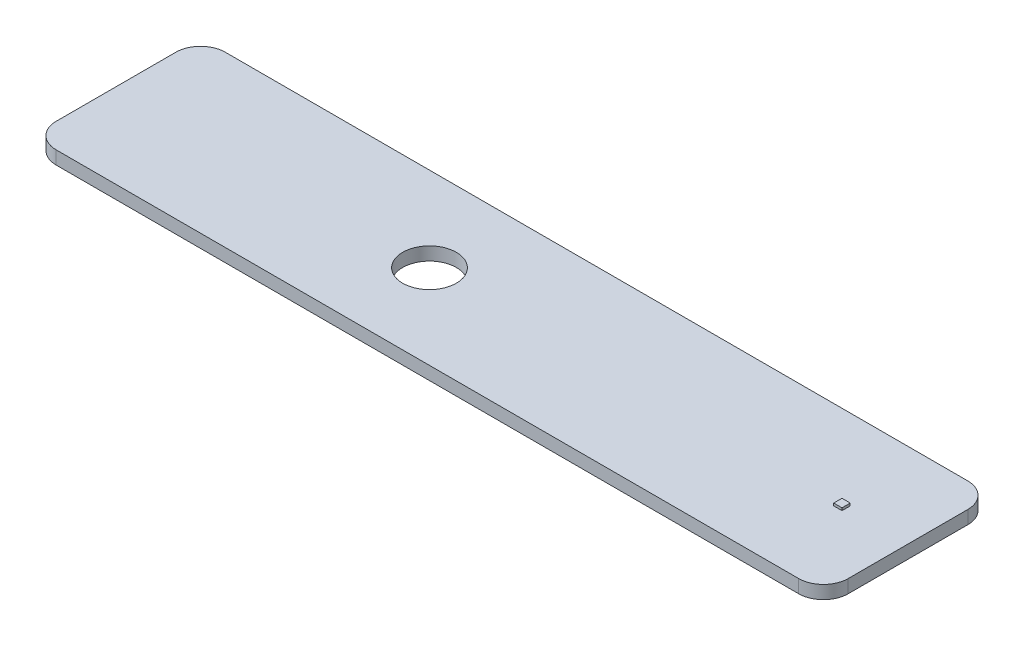
ISO-10303-21;
HEADER;
FILE_DESCRIPTION(('STEP AP214'),'2;1');
FILE_NAME('part.step','',(''),(''),'','','');
FILE_SCHEMA(('AUTOMOTIVE_DESIGN { 1 0 10303 214 1 1 1 1 }'));
ENDSEC;
DATA;
#1=APPLICATION_CONTEXT('core data for automotive mechanical design processes');
#2=APPLICATION_PROTOCOL_DEFINITION('international standard','automotive_design',2000,#1);
#3=PRODUCT_CONTEXT('',#1,'mechanical');
#4=PRODUCT('Part','Part','',(#3));
#5=PRODUCT_RELATED_PRODUCT_CATEGORY('part','',(#4));
#6=PRODUCT_DEFINITION_FORMATION('','',#4);
#7=PRODUCT_DEFINITION_CONTEXT('part definition',#1,'design');
#8=PRODUCT_DEFINITION('design','',#6,#7);
#9=PRODUCT_DEFINITION_SHAPE('','',#8);
#10=(LENGTH_UNIT() NAMED_UNIT(*) SI_UNIT(.MILLI.,.METRE.));
#11=(NAMED_UNIT(*) PLANE_ANGLE_UNIT() SI_UNIT($,.RADIAN.));
#12=(NAMED_UNIT(*) SI_UNIT($,.STERADIAN.) SOLID_ANGLE_UNIT());
#13=UNCERTAINTY_MEASURE_WITH_UNIT(LENGTH_MEASURE(1.E-05),#10,'distance_accuracy_value','');
#14=(GEOMETRIC_REPRESENTATION_CONTEXT(3) GLOBAL_UNCERTAINTY_ASSIGNED_CONTEXT((#13)) GLOBAL_UNIT_ASSIGNED_CONTEXT((#10,
#11,#12)) REPRESENTATION_CONTEXT('',''));
#15=CARTESIAN_POINT('',(0.,0.,0.));
#16=DIRECTION('',(0.,0.,1.));
#17=DIRECTION('',(1.,0.,0.));
#18=AXIS2_PLACEMENT_3D('',#15,#16,#17);
#19=CARTESIAN_POINT('',(-45.,1.6,7.25));
#20=DIRECTION('',(0.,1.,0.));
#21=DIRECTION('',(0.,0.,1.));
#22=AXIS2_PLACEMENT_3D('',#19,#20,#21);
#23=PLANE('',#22);
#24=CARTESIAN_POINT('',(-9.99999999999999,1.6,0.));
#25=DIRECTION('',(0.,1.,0.));
#26=DIRECTION('',(0.,0.,1.));
#27=AXIS2_PLACEMENT_3D('',#24,#25,#26);
#28=CIRCLE('',#27,3.25);
#29=CARTESIAN_POINT('',(-9.99999999999999,1.6,3.25));
#30=VERTEX_POINT('',#29);
#31=EDGE_CURVE('E416',#30,#30,#28,.T.);
#32=ORIENTED_EDGE('',*,*,#31,.F.);
#33=EDGE_LOOP('',(#32));
#34=FACE_BOUND('',#33,.T.);
#35=CARTESIAN_POINT('',(-45.,1.6,7.25));
#36=DIRECTION('',(0.,1.,0.));
#37=DIRECTION('',(0.,0.,1.));
#38=AXIS2_PLACEMENT_3D('',#35,#36,#37);
#39=CIRCLE('',#38,3.);
#40=CARTESIAN_POINT('',(-48.,1.6,7.25));
#41=VERTEX_POINT('',#40);
#42=CARTESIAN_POINT('',(-45.,1.6,10.25));
#43=VERTEX_POINT('',#42);
#44=EDGE_CURVE('E156',#41,#43,#39,.T.);
#45=ORIENTED_EDGE('',*,*,#44,.T.);
#46=DIRECTION('',(1.,0.,0.));
#47=VECTOR('',#46,1.);
#48=CARTESIAN_POINT('',(-45.,1.6,10.25));
#49=LINE('',#48,#47);
#50=CARTESIAN_POINT('',(45.,1.6,10.25));
#51=VERTEX_POINT('',#50);
#52=EDGE_CURVE('E159',#43,#51,#49,.T.);
#53=ORIENTED_EDGE('',*,*,#52,.T.);
#54=CARTESIAN_POINT('',(45.,1.6,7.25));
#55=DIRECTION('',(0.,1.,0.));
#56=DIRECTION('',(0.,0.,1.));
#57=AXIS2_PLACEMENT_3D('',#54,#55,#56);
#58=CIRCLE('',#57,3.);
#59=CARTESIAN_POINT('',(48.,1.6,7.25));
#60=VERTEX_POINT('',#59);
#61=EDGE_CURVE('E162',#51,#60,#58,.T.);
#62=ORIENTED_EDGE('',*,*,#61,.T.);
#63=DIRECTION('',(0.,0.,1.));
#64=VECTOR('',#63,1.);
#65=CARTESIAN_POINT('',(48.,1.6,-7.25));
#66=LINE('',#65,#64);
#67=CARTESIAN_POINT('',(48.,1.6,-7.25));
#68=VERTEX_POINT('',#67);
#69=EDGE_CURVE('E164',#68,#60,#66,.T.);
#70=ORIENTED_EDGE('',*,*,#69,.F.);
#71=CARTESIAN_POINT('',(45.,1.6,-7.25));
#72=DIRECTION('',(0.,-1.,0.));
#73=DIRECTION('',(0.,0.,-1.));
#74=AXIS2_PLACEMENT_3D('',#71,#72,#73);
#75=CIRCLE('',#74,3.);
#76=CARTESIAN_POINT('',(45.,1.6,-10.25));
#77=VERTEX_POINT('',#76);
#78=EDGE_CURVE('E167',#77,#68,#75,.T.);
#79=ORIENTED_EDGE('',*,*,#78,.F.);
#80=DIRECTION('',(1.,0.,0.));
#81=VECTOR('',#80,1.);
#82=CARTESIAN_POINT('',(-45.,1.6,-10.25));
#83=LINE('',#82,#81);
#84=CARTESIAN_POINT('',(-45.,1.6,-10.25));
#85=VERTEX_POINT('',#84);
#86=EDGE_CURVE('E170',#85,#77,#83,.T.);
#87=ORIENTED_EDGE('',*,*,#86,.F.);
#88=CARTESIAN_POINT('',(-45.,1.6,-7.25));
#89=DIRECTION('',(0.,1.,0.));
#90=DIRECTION('',(0.,0.,1.));
#91=AXIS2_PLACEMENT_3D('',#88,#89,#90);
#92=CIRCLE('',#91,3.);
#93=CARTESIAN_POINT('',(-48.,1.6,-7.25));
#94=VERTEX_POINT('',#93);
#95=EDGE_CURVE('E173',#85,#94,#92,.T.);
#96=ORIENTED_EDGE('',*,*,#95,.T.);
#97=DIRECTION('',(0.,0.,1.));
#98=VECTOR('',#97,1.);
#99=CARTESIAN_POINT('',(-48.,1.6,-7.25));
#100=LINE('',#99,#98);
#101=EDGE_CURVE('E175',#94,#41,#100,.T.);
#102=ORIENTED_EDGE('',*,*,#101,.T.);
#103=EDGE_LOOP('',(#45,#53,#62,#70,#79,#87,#96,#102));
#104=FACE_BOUND('',#103,.T.);
#105=DIRECTION('',(1.,0.,0.));
#106=VECTOR('',#105,1.);
#107=CARTESIAN_POINT('',(39.5,1.6,0.5));
#108=LINE('',#107,#106);
#109=CARTESIAN_POINT('',(39.4999999999999,1.6,0.5));
#110=VERTEX_POINT('',#109);
#111=CARTESIAN_POINT('',(40.4999999999999,1.6,0.5));
#112=VERTEX_POINT('',#111);
#113=EDGE_CURVE('E51',#110,#112,#108,.T.);
#114=ORIENTED_EDGE('',*,*,#113,.F.);
#115=DIRECTION('',(0.,0.,1.));
#116=VECTOR('',#115,1.);
#117=CARTESIAN_POINT('',(39.5,1.6,-0.5));
#118=LINE('',#117,#116);
#119=CARTESIAN_POINT('',(39.5,1.6,-0.5));
#120=VERTEX_POINT('',#119);
#121=EDGE_CURVE('E146',#120,#110,#118,.T.);
#122=ORIENTED_EDGE('',*,*,#121,.F.);
#123=DIRECTION('',(1.,0.,0.));
#124=VECTOR('',#123,1.);
#125=CARTESIAN_POINT('',(39.5,1.6,-0.5));
#126=LINE('',#125,#124);
#127=CARTESIAN_POINT('',(40.4999999999999,1.6,-0.5));
#128=VERTEX_POINT('',#127);
#129=EDGE_CURVE('E143',#120,#128,#126,.T.);
#130=ORIENTED_EDGE('',*,*,#129,.T.);
#131=DIRECTION('',(0.,0.,1.));
#132=VECTOR('',#131,1.);
#133=CARTESIAN_POINT('',(40.5,1.6,-0.5));
#134=LINE('',#133,#132);
#135=EDGE_CURVE('E56',#128,#112,#134,.T.);
#136=ORIENTED_EDGE('',*,*,#135,.T.);
#137=EDGE_LOOP('',(#114,#122,#130,#136));
#138=FACE_BOUND('',#137,.T.);
#139=ADVANCED_FACE('F36',(#34,#104,#138),#23,.T.);
#140=CARTESIAN_POINT('',(-45.,1.6,7.25));
#141=DIRECTION('',(0.,-1.,0.));
#142=DIRECTION('',(0.,0.,-1.));
#143=AXIS2_PLACEMENT_3D('',#140,#141,#142);
#144=CYLINDRICAL_SURFACE('',#143,3.);
#145=CARTESIAN_POINT('',(-45.,0.,7.25));
#146=DIRECTION('',(0.,1.,0.));
#147=DIRECTION('',(0.,0.,1.));
#148=AXIS2_PLACEMENT_3D('',#145,#146,#147);
#149=CIRCLE('',#148,3.);
#150=CARTESIAN_POINT('',(-48.,0.,7.25));
#151=VERTEX_POINT('',#150);
#152=CARTESIAN_POINT('',(-45.,0.,10.25));
#153=VERTEX_POINT('',#152);
#154=EDGE_CURVE('E147',#151,#153,#149,.T.);
#155=ORIENTED_EDGE('',*,*,#154,.T.);
#156=DIRECTION('',(0.,-1.,0.));
#157=VECTOR('',#156,1.);
#158=CARTESIAN_POINT('',(-45.,1.6,10.25));
#159=LINE('',#158,#157);
#160=EDGE_CURVE('E11',#43,#153,#159,.T.);
#161=ORIENTED_EDGE('',*,*,#160,.F.);
#162=ORIENTED_EDGE('',*,*,#44,.F.);
#163=DIRECTION('',(0.,-1.,0.));
#164=VECTOR('',#163,1.);
#165=CARTESIAN_POINT('',(-48.,1.6,7.25));
#166=LINE('',#165,#164);
#167=EDGE_CURVE('E176',#41,#151,#166,.T.);
#168=ORIENTED_EDGE('',*,*,#167,.T.);
#169=EDGE_LOOP('',(#155,#161,#162,#168));
#170=FACE_BOUND('',#169,.T.);
#171=ADVANCED_FACE('F38',(#170),#144,.T.);
#172=CARTESIAN_POINT('',(-45.,1.6,10.25));
#173=DIRECTION('',(0.,0.,-1.));
#174=DIRECTION('',(-1.,0.,0.));
#175=AXIS2_PLACEMENT_3D('',#172,#173,#174);
#176=PLANE('',#175);
#177=DIRECTION('',(1.,0.,0.));
#178=VECTOR('',#177,1.);
#179=CARTESIAN_POINT('',(-45.,0.,10.25));
#180=LINE('',#179,#178);
#181=CARTESIAN_POINT('',(45.,0.,10.25));
#182=VERTEX_POINT('',#181);
#183=EDGE_CURVE('E150',#153,#182,#180,.T.);
#184=ORIENTED_EDGE('',*,*,#183,.T.);
#185=DIRECTION('',(0.,-1.,0.));
#186=VECTOR('',#185,1.);
#187=CARTESIAN_POINT('',(45.,1.6,10.25));
#188=LINE('',#187,#186);
#189=EDGE_CURVE('E44',#51,#182,#188,.T.);
#190=ORIENTED_EDGE('',*,*,#189,.F.);
#191=ORIENTED_EDGE('',*,*,#52,.F.);
#192=ORIENTED_EDGE('',*,*,#160,.T.);
#193=EDGE_LOOP('',(#184,#190,#191,#192));
#194=FACE_BOUND('',#193,.T.);
#195=ADVANCED_FACE('F243',(#194),#176,.F.);
#196=CARTESIAN_POINT('',(45.,1.6,7.25));
#197=DIRECTION('',(0.,-1.,0.));
#198=DIRECTION('',(0.,0.,-1.));
#199=AXIS2_PLACEMENT_3D('',#196,#197,#198);
#200=CYLINDRICAL_SURFACE('',#199,3.);
#201=CARTESIAN_POINT('',(45.,0.,7.25));
#202=DIRECTION('',(0.,1.,0.));
#203=DIRECTION('',(0.,0.,1.));
#204=AXIS2_PLACEMENT_3D('',#201,#202,#203);
#205=CIRCLE('',#204,3.);
#206=CARTESIAN_POINT('',(48.,0.,7.25));
#207=VERTEX_POINT('',#206);
#208=EDGE_CURVE('E179',#182,#207,#205,.T.);
#209=ORIENTED_EDGE('',*,*,#208,.T.);
#210=DIRECTION('',(0.,-1.,0.));
#211=VECTOR('',#210,1.);
#212=CARTESIAN_POINT('',(48.,1.6,7.25));
#213=LINE('',#212,#211);
#214=EDGE_CURVE('E205',#60,#207,#213,.T.);
#215=ORIENTED_EDGE('',*,*,#214,.F.);
#216=ORIENTED_EDGE('',*,*,#61,.F.);
#217=ORIENTED_EDGE('',*,*,#189,.T.);
#218=EDGE_LOOP('',(#209,#215,#216,#217));
#219=FACE_BOUND('',#218,.T.);
#220=ADVANCED_FACE('F211',(#219),#200,.T.);
#221=CARTESIAN_POINT('',(48.,1.6,-7.25));
#222=DIRECTION('',(1.,0.,0.));
#223=DIRECTION('',(0.,0.,-1.));
#224=AXIS2_PLACEMENT_3D('',#221,#222,#223);
#225=PLANE('',#224);
#226=DIRECTION('',(0.,0.,1.));
#227=VECTOR('',#226,1.);
#228=CARTESIAN_POINT('',(48.,0.,-7.25));
#229=LINE('',#228,#227);
#230=CARTESIAN_POINT('',(48.,0.,-7.25));
#231=VERTEX_POINT('',#230);
#232=EDGE_CURVE('E182',#231,#207,#229,.T.);
#233=ORIENTED_EDGE('',*,*,#232,.F.);
#234=DIRECTION('',(0.,-1.,0.));
#235=VECTOR('',#234,1.);
#236=CARTESIAN_POINT('',(48.,1.6,-7.25));
#237=LINE('',#236,#235);
#238=EDGE_CURVE('E203',#68,#231,#237,.T.);
#239=ORIENTED_EDGE('',*,*,#238,.F.);
#240=ORIENTED_EDGE('',*,*,#69,.T.);
#241=ORIENTED_EDGE('',*,*,#214,.T.);
#242=EDGE_LOOP('',(#233,#239,#240,#241));
#243=FACE_BOUND('',#242,.T.);
#244=ADVANCED_FACE('F220',(#243),#225,.T.);
#245=CARTESIAN_POINT('',(45.,1.6,-7.25));
#246=DIRECTION('',(0.,-1.,0.));
#247=DIRECTION('',(0.,0.,-1.));
#248=AXIS2_PLACEMENT_3D('',#245,#246,#247);
#249=CYLINDRICAL_SURFACE('',#248,3.);
#250=CARTESIAN_POINT('',(45.,0.,-7.25));
#251=DIRECTION('',(0.,-1.,0.));
#252=DIRECTION('',(0.,0.,-1.));
#253=AXIS2_PLACEMENT_3D('',#250,#251,#252);
#254=CIRCLE('',#253,3.);
#255=CARTESIAN_POINT('',(45.,0.,-10.25));
#256=VERTEX_POINT('',#255);
#257=EDGE_CURVE('E185',#256,#231,#254,.T.);
#258=ORIENTED_EDGE('',*,*,#257,.F.);
#259=DIRECTION('',(0.,-1.,0.));
#260=VECTOR('',#259,1.);
#261=CARTESIAN_POINT('',(45.,1.6,-10.25));
#262=LINE('',#261,#260);
#263=EDGE_CURVE('E201',#77,#256,#262,.T.);
#264=ORIENTED_EDGE('',*,*,#263,.F.);
#265=ORIENTED_EDGE('',*,*,#78,.T.);
#266=ORIENTED_EDGE('',*,*,#238,.T.);
#267=EDGE_LOOP('',(#258,#264,#265,#266));
#268=FACE_BOUND('',#267,.T.);
#269=ADVANCED_FACE('F226',(#268),#249,.T.);
#270=CARTESIAN_POINT('',(-45.,1.6,-10.25));
#271=DIRECTION('',(0.,0.,-1.));
#272=DIRECTION('',(-1.,0.,0.));
#273=AXIS2_PLACEMENT_3D('',#270,#271,#272);
#274=PLANE('',#273);
#275=DIRECTION('',(1.,0.,0.));
#276=VECTOR('',#275,1.);
#277=CARTESIAN_POINT('',(-45.,0.,-10.25));
#278=LINE('',#277,#276);
#279=CARTESIAN_POINT('',(-45.,0.,-10.25));
#280=VERTEX_POINT('',#279);
#281=EDGE_CURVE('E188',#280,#256,#278,.T.);
#282=ORIENTED_EDGE('',*,*,#281,.F.);
#283=DIRECTION('',(0.,-1.,0.));
#284=VECTOR('',#283,1.);
#285=CARTESIAN_POINT('',(-45.,1.6,-10.25));
#286=LINE('',#285,#284);
#287=EDGE_CURVE('E199',#85,#280,#286,.T.);
#288=ORIENTED_EDGE('',*,*,#287,.F.);
#289=ORIENTED_EDGE('',*,*,#86,.T.);
#290=ORIENTED_EDGE('',*,*,#263,.T.);
#291=EDGE_LOOP('',(#282,#288,#289,#290));
#292=FACE_BOUND('',#291,.T.);
#293=ADVANCED_FACE('F229',(#292),#274,.T.);
#294=CARTESIAN_POINT('',(-45.,1.6,-7.25));
#295=DIRECTION('',(0.,-1.,0.));
#296=DIRECTION('',(0.,0.,-1.));
#297=AXIS2_PLACEMENT_3D('',#294,#295,#296);
#298=CYLINDRICAL_SURFACE('',#297,3.);
#299=CARTESIAN_POINT('',(-45.,0.,-7.25));
#300=DIRECTION('',(0.,1.,0.));
#301=DIRECTION('',(0.,0.,1.));
#302=AXIS2_PLACEMENT_3D('',#299,#300,#301);
#303=CIRCLE('',#302,3.);
#304=CARTESIAN_POINT('',(-48.,0.,-7.25));
#305=VERTEX_POINT('',#304);
#306=EDGE_CURVE('E191',#280,#305,#303,.T.);
#307=ORIENTED_EDGE('',*,*,#306,.T.);
#308=DIRECTION('',(0.,-1.,0.));
#309=VECTOR('',#308,1.);
#310=CARTESIAN_POINT('',(-48.,1.6,-7.25));
#311=LINE('',#310,#309);
#312=EDGE_CURVE('E196',#94,#305,#311,.T.);
#313=ORIENTED_EDGE('',*,*,#312,.F.);
#314=ORIENTED_EDGE('',*,*,#95,.F.);
#315=ORIENTED_EDGE('',*,*,#287,.T.);
#316=EDGE_LOOP('',(#307,#313,#314,#315));
#317=FACE_BOUND('',#316,.T.);
#318=ADVANCED_FACE('F235',(#317),#298,.T.);
#319=CARTESIAN_POINT('',(-48.,1.6,-7.25));
#320=DIRECTION('',(1.,0.,0.));
#321=DIRECTION('',(0.,0.,-1.));
#322=AXIS2_PLACEMENT_3D('',#319,#320,#321);
#323=PLANE('',#322);
#324=DIRECTION('',(0.,0.,1.));
#325=VECTOR('',#324,1.);
#326=CARTESIAN_POINT('',(-48.,0.,-7.25));
#327=LINE('',#326,#325);
#328=EDGE_CURVE('E160',#305,#151,#327,.T.);
#329=ORIENTED_EDGE('',*,*,#328,.T.);
#330=ORIENTED_EDGE('',*,*,#167,.F.);
#331=ORIENTED_EDGE('',*,*,#101,.F.);
#332=ORIENTED_EDGE('',*,*,#312,.T.);
#333=EDGE_LOOP('',(#329,#330,#331,#332));
#334=FACE_BOUND('',#333,.T.);
#335=ADVANCED_FACE('F239',(#334),#323,.F.);
#336=CARTESIAN_POINT('',(-45.,0.,7.25));
#337=DIRECTION('',(0.,1.,0.));
#338=DIRECTION('',(0.,0.,1.));
#339=AXIS2_PLACEMENT_3D('',#336,#337,#338);
#340=PLANE('',#339);
#341=CARTESIAN_POINT('',(-9.99999999999999,0.,0.));
#342=DIRECTION('',(0.,1.,0.));
#343=DIRECTION('',(0.,0.,1.));
#344=AXIS2_PLACEMENT_3D('',#341,#342,#343);
#345=CIRCLE('',#344,3.25);
#346=CARTESIAN_POINT('',(-9.99999999999999,0.,3.25));
#347=VERTEX_POINT('',#346);
#348=EDGE_CURVE('E414',#347,#347,#345,.T.);
#349=ORIENTED_EDGE('',*,*,#348,.T.);
#350=EDGE_LOOP('',(#349));
#351=FACE_BOUND('',#350,.T.);
#352=ORIENTED_EDGE('',*,*,#154,.F.);
#353=ORIENTED_EDGE('',*,*,#328,.F.);
#354=ORIENTED_EDGE('',*,*,#306,.F.);
#355=ORIENTED_EDGE('',*,*,#281,.T.);
#356=ORIENTED_EDGE('',*,*,#257,.T.);
#357=ORIENTED_EDGE('',*,*,#232,.T.);
#358=ORIENTED_EDGE('',*,*,#208,.F.);
#359=ORIENTED_EDGE('',*,*,#183,.F.);
#360=EDGE_LOOP('',(#352,#353,#354,#355,#356,#357,#358,#359));
#361=FACE_BOUND('',#360,.T.);
#362=ADVANCED_FACE('F216',(#351,#361),#340,.F.);
#363=CARTESIAN_POINT('',(39.5,1.9,-0.5));
#364=DIRECTION('',(1.,0.,0.));
#365=DIRECTION('',(0.,0.,-1.));
#366=AXIS2_PLACEMENT_3D('',#363,#364,#365);
#367=PLANE('',#366);
#368=ORIENTED_EDGE('',*,*,#121,.T.);
#369=DIRECTION('',(0.,-1.,0.));
#370=VECTOR('',#369,1.);
#371=CARTESIAN_POINT('',(39.5,1.9,0.5));
#372=LINE('',#371,#370);
#373=CARTESIAN_POINT('',(39.5,1.9,0.5));
#374=VERTEX_POINT('',#373);
#375=EDGE_CURVE('E127',#374,#110,#372,.T.);
#376=ORIENTED_EDGE('',*,*,#375,.F.);
#377=DIRECTION('',(0.,0.,1.));
#378=VECTOR('',#377,1.);
#379=CARTESIAN_POINT('',(39.5,1.9,-0.5));
#380=LINE('',#379,#378);
#381=CARTESIAN_POINT('',(39.5,1.9,-0.5));
#382=VERTEX_POINT('',#381);
#383=EDGE_CURVE('E134',#382,#374,#380,.T.);
#384=ORIENTED_EDGE('',*,*,#383,.F.);
#385=DIRECTION('',(0.,-1.,0.));
#386=VECTOR('',#385,1.);
#387=CARTESIAN_POINT('',(39.5,1.9,-0.5));
#388=LINE('',#387,#386);
#389=EDGE_CURVE('E422',#382,#120,#388,.T.);
#390=ORIENTED_EDGE('',*,*,#389,.T.);
#391=EDGE_LOOP('',(#368,#376,#384,#390));
#392=FACE_BOUND('',#391,.T.);
#393=ADVANCED_FACE('F145',(#392),#367,.F.);
#394=CARTESIAN_POINT('',(39.5,1.9,0.5));
#395=DIRECTION('',(0.,0.,-1.));
#396=DIRECTION('',(-1.,0.,0.));
#397=AXIS2_PLACEMENT_3D('',#394,#395,#396);
#398=PLANE('',#397);
#399=ORIENTED_EDGE('',*,*,#113,.T.);
#400=DIRECTION('',(0.,-1.,0.));
#401=VECTOR('',#400,1.);
#402=CARTESIAN_POINT('',(40.5,1.9,0.5));
#403=LINE('',#402,#401);
#404=CARTESIAN_POINT('',(40.5,1.9,0.5));
#405=VERTEX_POINT('',#404);
#406=EDGE_CURVE('E129',#405,#112,#403,.T.);
#407=ORIENTED_EDGE('',*,*,#406,.F.);
#408=DIRECTION('',(1.,0.,0.));
#409=VECTOR('',#408,1.);
#410=CARTESIAN_POINT('',(39.5,1.9,0.5));
#411=LINE('',#410,#409);
#412=EDGE_CURVE('E123',#374,#405,#411,.T.);
#413=ORIENTED_EDGE('',*,*,#412,.F.);
#414=ORIENTED_EDGE('',*,*,#375,.T.);
#415=EDGE_LOOP('',(#399,#407,#413,#414));
#416=FACE_BOUND('',#415,.T.);
#417=ADVANCED_FACE('F125',(#416),#398,.F.);
#418=CARTESIAN_POINT('',(40.5,1.9,-0.5));
#419=DIRECTION('',(1.,0.,0.));
#420=DIRECTION('',(0.,0.,-1.));
#421=AXIS2_PLACEMENT_3D('',#418,#419,#420);
#422=PLANE('',#421);
#423=ORIENTED_EDGE('',*,*,#135,.F.);
#424=DIRECTION('',(0.,-1.,0.));
#425=VECTOR('',#424,1.);
#426=CARTESIAN_POINT('',(40.5,1.9,-0.5));
#427=LINE('',#426,#425);
#428=CARTESIAN_POINT('',(40.5,1.9,-0.5));
#429=VERTEX_POINT('',#428);
#430=EDGE_CURVE('E152',#429,#128,#427,.T.);
#431=ORIENTED_EDGE('',*,*,#430,.F.);
#432=DIRECTION('',(0.,0.,1.));
#433=VECTOR('',#432,1.);
#434=CARTESIAN_POINT('',(40.5,1.9,-0.5));
#435=LINE('',#434,#433);
#436=EDGE_CURVE('E133',#429,#405,#435,.T.);
#437=ORIENTED_EDGE('',*,*,#436,.T.);
#438=ORIENTED_EDGE('',*,*,#406,.T.);
#439=EDGE_LOOP('',(#423,#431,#437,#438));
#440=FACE_BOUND('',#439,.T.);
#441=ADVANCED_FACE('F307',(#440),#422,.T.);
#442=CARTESIAN_POINT('',(39.5,1.9,-0.5));
#443=DIRECTION('',(0.,0.,-1.));
#444=DIRECTION('',(-1.,0.,0.));
#445=AXIS2_PLACEMENT_3D('',#442,#443,#444);
#446=PLANE('',#445);
#447=ORIENTED_EDGE('',*,*,#129,.F.);
#448=ORIENTED_EDGE('',*,*,#389,.F.);
#449=DIRECTION('',(1.,0.,0.));
#450=VECTOR('',#449,1.);
#451=CARTESIAN_POINT('',(39.5,1.9,-0.5));
#452=LINE('',#451,#450);
#453=EDGE_CURVE('E140',#382,#429,#452,.T.);
#454=ORIENTED_EDGE('',*,*,#453,.T.);
#455=ORIENTED_EDGE('',*,*,#430,.T.);
#456=EDGE_LOOP('',(#447,#448,#454,#455));
#457=FACE_BOUND('',#456,.T.);
#458=ADVANCED_FACE('F313',(#457),#446,.T.);
#459=CARTESIAN_POINT('',(0.,1.9,0.));
#460=DIRECTION('',(0.,1.,0.));
#461=DIRECTION('',(0.,0.,1.));
#462=AXIS2_PLACEMENT_3D('',#459,#460,#461);
#463=PLANE('',#462);
#464=ORIENTED_EDGE('',*,*,#383,.T.);
#465=ORIENTED_EDGE('',*,*,#412,.T.);
#466=ORIENTED_EDGE('',*,*,#436,.F.);
#467=ORIENTED_EDGE('',*,*,#453,.F.);
#468=EDGE_LOOP('',(#464,#465,#466,#467));
#469=FACE_BOUND('',#468,.T.);
#470=ADVANCED_FACE('F138',(#469),#463,.T.);
#471=CARTESIAN_POINT('',(-9.99999999999999,0.,0.));
#472=DIRECTION('',(0.,1.,0.));
#473=DIRECTION('',(0.,0.,1.));
#474=AXIS2_PLACEMENT_3D('',#471,#472,#473);
#475=CYLINDRICAL_SURFACE('',#474,3.25);
#476=ORIENTED_EDGE('',*,*,#348,.F.);
#477=EDGE_LOOP('',(#476));
#478=FACE_BOUND('',#477,.T.);
#479=ORIENTED_EDGE('',*,*,#31,.T.);
#480=EDGE_LOOP('',(#479));
#481=FACE_BOUND('',#480,.T.);
#482=ADVANCED_FACE('F328',(#478,#481),#475,.F.);
#483=CLOSED_SHELL('',(#139,#171,#195,#220,#244,#269,#293,#318,#335,#362,#393,#417,#441,#458,
#470,#482));
#484=MANIFOLD_SOLID_BREP('B2',#483);
#485=ADVANCED_BREP_SHAPE_REPRESENTATION('',(#18,#484),#14);
#486=SHAPE_DEFINITION_REPRESENTATION(#9,#485);
ENDSEC;
END-ISO-10303-21;
